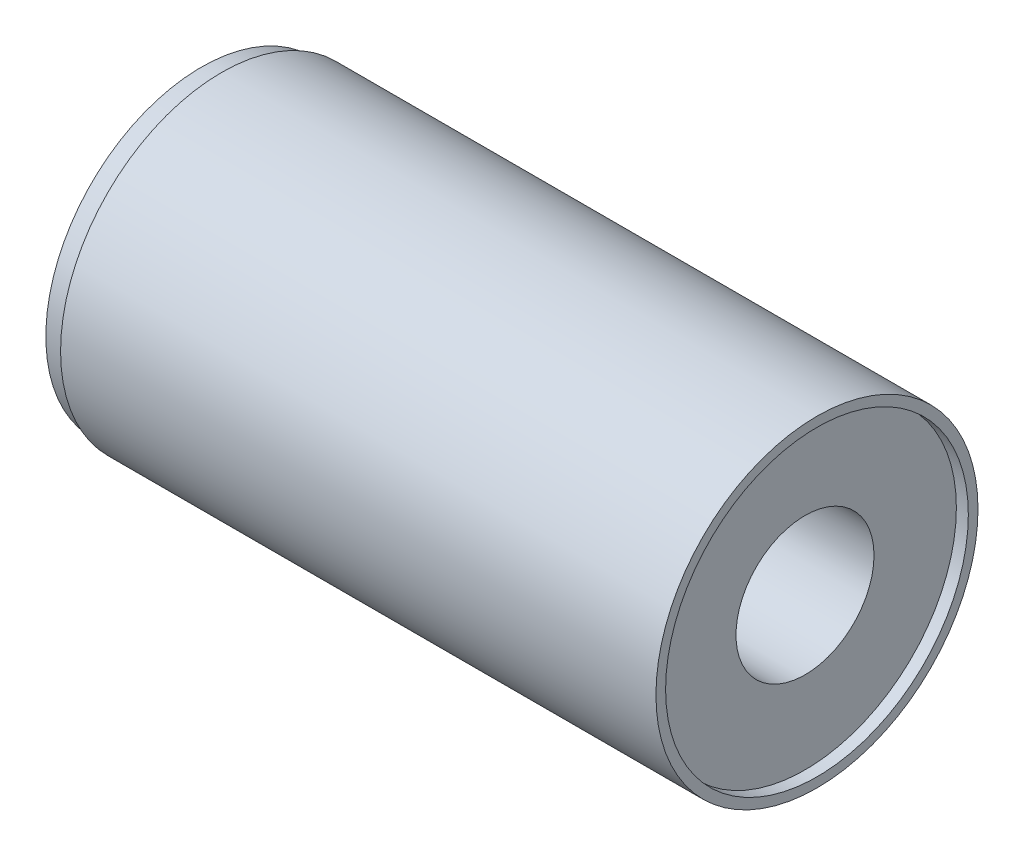
ISO-10303-21;
HEADER;
FILE_DESCRIPTION(('STEP AP214'),'2;1');
FILE_NAME('part.step','',(''),(''),'','','');
FILE_SCHEMA(('AUTOMOTIVE_DESIGN { 1 0 10303 214 1 1 1 1 }'));
ENDSEC;
DATA;
#1=APPLICATION_CONTEXT('core data for automotive mechanical design processes');
#2=APPLICATION_PROTOCOL_DEFINITION('international standard','automotive_design',2000,#1);
#3=PRODUCT_CONTEXT('',#1,'mechanical');
#4=PRODUCT('Part','Part','',(#3));
#5=PRODUCT_RELATED_PRODUCT_CATEGORY('part','',(#4));
#6=PRODUCT_DEFINITION_FORMATION('','',#4);
#7=PRODUCT_DEFINITION_CONTEXT('part definition',#1,'design');
#8=PRODUCT_DEFINITION('design','',#6,#7);
#9=PRODUCT_DEFINITION_SHAPE('','',#8);
#10=(LENGTH_UNIT() NAMED_UNIT(*) SI_UNIT(.MILLI.,.METRE.));
#11=(NAMED_UNIT(*) PLANE_ANGLE_UNIT() SI_UNIT($,.RADIAN.));
#12=(NAMED_UNIT(*) SI_UNIT($,.STERADIAN.) SOLID_ANGLE_UNIT());
#13=UNCERTAINTY_MEASURE_WITH_UNIT(LENGTH_MEASURE(1.E-05),#10,'distance_accuracy_value','');
#14=(GEOMETRIC_REPRESENTATION_CONTEXT(3) GLOBAL_UNCERTAINTY_ASSIGNED_CONTEXT((#13)) GLOBAL_UNIT_ASSIGNED_CONTEXT((#10,
#11,#12)) REPRESENTATION_CONTEXT('',''));
#15=CARTESIAN_POINT('',(0.,0.,0.));
#16=DIRECTION('',(0.,0.,1.));
#17=DIRECTION('',(1.,0.,0.));
#18=AXIS2_PLACEMENT_3D('',#15,#16,#17);
#19=CARTESIAN_POINT('',(53.35,0.,9.75));
#20=DIRECTION('',(1.,0.,0.));
#21=DIRECTION('',(0.,1.,0.));
#22=AXIS2_PLACEMENT_3D('',#19,#20,#21);
#23=PLANE('',#22);
#24=CARTESIAN_POINT('',(53.35,0.,9.75));
#25=DIRECTION('',(-1.,0.,0.));
#26=DIRECTION('',(0.,0.,1.));
#27=AXIS2_PLACEMENT_3D('',#24,#25,#26);
#28=CIRCLE('',#27,0.75);
#29=CARTESIAN_POINT('',(53.35,0.,10.5));
#30=VERTEX_POINT('',#29);
#31=EDGE_CURVE('E28',#30,#30,#28,.T.);
#32=ORIENTED_EDGE('',*,*,#31,.T.);
#33=EDGE_LOOP('',(#32));
#34=FACE_BOUND('',#33,.T.);
#35=ADVANCED_FACE('F17',(#34),#23,.F.);
#36=CARTESIAN_POINT('',(52.6,0.,9.75));
#37=DIRECTION('',(-1.,0.,0.));
#38=DIRECTION('',(0.,0.,-1.));
#39=AXIS2_PLACEMENT_3D('',#36,#37,#38);
#40=CYLINDRICAL_SURFACE('',#39,0.75);
#41=ORIENTED_EDGE('',*,*,#31,.F.);
#42=DIRECTION('',(-1.,0.,0.));
#43=VECTOR('',#42,1.);
#44=CARTESIAN_POINT('',(52.6,0.,10.5));
#45=LINE('',#44,#43);
#46=CARTESIAN_POINT('',(51.85,0.,10.5));
#47=VERTEX_POINT('',#46);
#48=EDGE_CURVE('E11',#30,#47,#45,.T.);
#49=ORIENTED_EDGE('',*,*,#48,.T.);
#50=CARTESIAN_POINT('',(51.85,0.,9.75));
#51=DIRECTION('',(1.,0.,0.));
#52=DIRECTION('',(0.,0.,-1.));
#53=AXIS2_PLACEMENT_3D('',#50,#51,#52);
#54=CIRCLE('',#53,0.75);
#55=EDGE_CURVE('E88',#47,#47,#54,.T.);
#56=ORIENTED_EDGE('',*,*,#55,.F.);
#57=ORIENTED_EDGE('',*,*,#48,.F.);
#58=EDGE_LOOP('',(#41,#49,#56,#57));
#59=FACE_BOUND('',#58,.T.);
#60=ADVANCED_FACE('F174',(#59),#40,.F.);
#61=CARTESIAN_POINT('',(49.85,0.,8.));
#62=DIRECTION('',(-1.,0.,0.));
#63=DIRECTION('',(0.,0.,1.));
#64=AXIS2_PLACEMENT_3D('',#61,#62,#63);
#65=PLANE('',#64);
#66=CARTESIAN_POINT('',(49.85,0.,0.));
#67=DIRECTION('',(1.,0.,0.));
#68=DIRECTION('',(0.,0.,-1.));
#69=AXIS2_PLACEMENT_3D('',#66,#67,#68);
#70=CIRCLE('',#69,7.5);
#71=CARTESIAN_POINT('',(49.85,0.,-7.5));
#72=VERTEX_POINT('',#71);
#73=EDGE_CURVE('E133',#72,#72,#70,.T.);
#74=ORIENTED_EDGE('',*,*,#73,.T.);
#75=EDGE_LOOP('',(#74));
#76=FACE_BOUND('',#75,.T.);
#77=CARTESIAN_POINT('',(49.85,0.,0.));
#78=DIRECTION('',(-1.,0.,0.));
#79=DIRECTION('',(0.,0.,-1.));
#80=AXIS2_PLACEMENT_3D('',#77,#78,#79);
#81=CIRCLE('',#80,8.5);
#82=CARTESIAN_POINT('',(49.85,0.,-8.5));
#83=VERTEX_POINT('',#82);
#84=EDGE_CURVE('E92',#83,#83,#81,.T.);
#85=ORIENTED_EDGE('',*,*,#84,.T.);
#86=EDGE_LOOP('',(#85));
#87=FACE_BOUND('',#86,.T.);
#88=ADVANCED_FACE('F19',(#76,#87),#65,.T.);
#89=CARTESIAN_POINT('',(85.3,0.,0.));
#90=DIRECTION('',(-1.,0.,0.));
#91=DIRECTION('',(0.,0.,1.));
#92=AXIS2_PLACEMENT_3D('',#89,#90,#91);
#93=CYLINDRICAL_SURFACE('',#92,7.5);
#94=CARTESIAN_POINT('',(117.45,0.,0.));
#95=DIRECTION('',(-1.,0.,0.));
#96=DIRECTION('',(0.,0.,1.));
#97=AXIS2_PLACEMENT_3D('',#94,#95,#96);
#98=CIRCLE('',#97,7.5);
#99=CARTESIAN_POINT('',(117.45,0.,-7.5));
#100=VERTEX_POINT('',#99);
#101=EDGE_CURVE('E112',#100,#100,#98,.T.);
#102=ORIENTED_EDGE('',*,*,#101,.F.);
#103=DIRECTION('',(-1.,0.,0.));
#104=VECTOR('',#103,1.);
#105=CARTESIAN_POINT('',(85.3,0.,-7.5));
#106=LINE('',#105,#104);
#107=EDGE_CURVE('E115',#100,#72,#106,.T.);
#108=ORIENTED_EDGE('',*,*,#107,.T.);
#109=ORIENTED_EDGE('',*,*,#73,.F.);
#110=ORIENTED_EDGE('',*,*,#107,.F.);
#111=EDGE_LOOP('',(#102,#108,#109,#110));
#112=FACE_BOUND('',#111,.T.);
#113=ADVANCED_FACE('F189',(#112),#93,.F.);
#114=CARTESIAN_POINT('',(117.45,0.,0.));
#115=DIRECTION('',(-1.,0.,0.));
#116=DIRECTION('',(0.,0.,1.));
#117=AXIS2_PLACEMENT_3D('',#114,#115,#116);
#118=PLANE('',#117);
#119=ORIENTED_EDGE('',*,*,#101,.T.);
#120=EDGE_LOOP('',(#119));
#121=FACE_BOUND('',#120,.T.);
#122=CARTESIAN_POINT('',(117.45,0.,0.));
#123=DIRECTION('',(1.,0.,0.));
#124=DIRECTION('',(0.,0.,-1.));
#125=AXIS2_PLACEMENT_3D('',#122,#123,#124);
#126=CIRCLE('',#125,16.45);
#127=CARTESIAN_POINT('',(117.45,0.,-16.45));
#128=VERTEX_POINT('',#127);
#129=EDGE_CURVE('E106',#128,#128,#126,.T.);
#130=ORIENTED_EDGE('',*,*,#129,.T.);
#131=EDGE_LOOP('',(#130));
#132=FACE_BOUND('',#131,.T.);
#133=ADVANCED_FACE('F186',(#121,#132),#118,.F.);
#134=CARTESIAN_POINT('',(118.1,0.,0.));
#135=DIRECTION('',(1.,0.,0.));
#136=DIRECTION('',(0.,0.,1.));
#137=AXIS2_PLACEMENT_3D('',#134,#135,#136);
#138=CYLINDRICAL_SURFACE('',#137,16.45);
#139=ORIENTED_EDGE('',*,*,#129,.F.);
#140=DIRECTION('',(1.,0.,0.));
#141=VECTOR('',#140,1.);
#142=CARTESIAN_POINT('',(118.1,0.,-16.45));
#143=LINE('',#142,#141);
#144=CARTESIAN_POINT('',(118.75,0.,-16.45));
#145=VERTEX_POINT('',#144);
#146=EDGE_CURVE('E110',#128,#145,#143,.T.);
#147=ORIENTED_EDGE('',*,*,#146,.T.);
#148=CARTESIAN_POINT('',(118.75,0.,0.));
#149=DIRECTION('',(-1.,0.,0.));
#150=DIRECTION('',(0.,0.,1.));
#151=AXIS2_PLACEMENT_3D('',#148,#149,#150);
#152=CIRCLE('',#151,16.45);
#153=EDGE_CURVE('E111',#145,#145,#152,.T.);
#154=ORIENTED_EDGE('',*,*,#153,.F.);
#155=ORIENTED_EDGE('',*,*,#146,.F.);
#156=EDGE_LOOP('',(#139,#147,#154,#155));
#157=FACE_BOUND('',#156,.T.);
#158=ADVANCED_FACE('F188',(#157),#138,.F.);
#159=CARTESIAN_POINT('',(118.75,0.,12.5));
#160=DIRECTION('',(1.,0.,0.));
#161=DIRECTION('',(0.,1.,0.));
#162=AXIS2_PLACEMENT_3D('',#159,#160,#161);
#163=PLANE('',#162);
#164=ORIENTED_EDGE('',*,*,#153,.T.);
#165=EDGE_LOOP('',(#164));
#166=FACE_BOUND('',#165,.T.);
#167=CARTESIAN_POINT('',(118.75,0.,0.));
#168=DIRECTION('',(1.,0.,0.));
#169=DIRECTION('',(0.,0.,-1.));
#170=AXIS2_PLACEMENT_3D('',#167,#168,#169);
#171=CIRCLE('',#170,17.5);
#172=CARTESIAN_POINT('',(118.75,0.,-17.5));
#173=VERTEX_POINT('',#172);
#174=EDGE_CURVE('E137',#173,#173,#171,.T.);
#175=ORIENTED_EDGE('',*,*,#174,.T.);
#176=EDGE_LOOP('',(#175));
#177=FACE_BOUND('',#176,.T.);
#178=ADVANCED_FACE('F170',(#166,#177),#163,.T.);
#179=CARTESIAN_POINT('',(86.4,0.,0.));
#180=DIRECTION('',(-1.,0.,0.));
#181=DIRECTION('',(0.,0.,1.));
#182=AXIS2_PLACEMENT_3D('',#179,#180,#181);
#183=CYLINDRICAL_SURFACE('',#182,17.5);
#184=CARTESIAN_POINT('',(54.05,0.,0.));
#185=DIRECTION('',(-1.,0.,0.));
#186=DIRECTION('',(0.,0.,-1.));
#187=AXIS2_PLACEMENT_3D('',#184,#185,#186);
#188=CIRCLE('',#187,17.5);
#189=CARTESIAN_POINT('',(54.05,0.,-17.5));
#190=VERTEX_POINT('',#189);
#191=EDGE_CURVE('E145',#190,#190,#188,.T.);
#192=ORIENTED_EDGE('',*,*,#191,.F.);
#193=DIRECTION('',(1.,0.,0.));
#194=VECTOR('',#193,1.);
#195=CARTESIAN_POINT('',(86.4,0.,-17.5));
#196=LINE('',#195,#194);
#197=EDGE_CURVE('E142',#190,#173,#196,.T.);
#198=ORIENTED_EDGE('',*,*,#197,.T.);
#199=ORIENTED_EDGE('',*,*,#174,.F.);
#200=ORIENTED_EDGE('',*,*,#197,.F.);
#201=EDGE_LOOP('',(#192,#198,#199,#200));
#202=FACE_BOUND('',#201,.T.);
#203=ADVANCED_FACE('F159',(#202),#183,.T.);
#204=CARTESIAN_POINT('',(54.05,0.,17.2));
#205=DIRECTION('',(-1.,0.,0.));
#206=DIRECTION('',(0.,0.,1.));
#207=AXIS2_PLACEMENT_3D('',#204,#205,#206);
#208=PLANE('',#207);
#209=CARTESIAN_POINT('',(54.05,0.,0.));
#210=DIRECTION('',(1.,0.,0.));
#211=DIRECTION('',(0.,0.,-1.));
#212=AXIS2_PLACEMENT_3D('',#209,#210,#211);
#213=CIRCLE('',#212,16.9);
#214=CARTESIAN_POINT('',(54.05,0.,-16.9));
#215=VERTEX_POINT('',#214);
#216=EDGE_CURVE('E86',#215,#215,#213,.T.);
#217=ORIENTED_EDGE('',*,*,#216,.T.);
#218=EDGE_LOOP('',(#217));
#219=FACE_BOUND('',#218,.T.);
#220=ORIENTED_EDGE('',*,*,#191,.T.);
#221=EDGE_LOOP('',(#220));
#222=FACE_BOUND('',#221,.T.);
#223=ADVANCED_FACE('F161',(#219,#222),#208,.T.);
#224=CARTESIAN_POINT('',(52.95,0.,0.));
#225=DIRECTION('',(-1.,0.,0.));
#226=DIRECTION('',(0.,0.,1.));
#227=AXIS2_PLACEMENT_3D('',#224,#225,#226);
#228=CYLINDRICAL_SURFACE('',#227,16.9);
#229=CARTESIAN_POINT('',(51.85,0.,0.));
#230=DIRECTION('',(-1.,0.,0.));
#231=DIRECTION('',(0.,0.,-1.));
#232=AXIS2_PLACEMENT_3D('',#229,#230,#231);
#233=CIRCLE('',#232,16.9);
#234=CARTESIAN_POINT('',(51.85,0.,-16.9));
#235=VERTEX_POINT('',#234);
#236=EDGE_CURVE('E84',#235,#235,#233,.T.);
#237=ORIENTED_EDGE('',*,*,#236,.F.);
#238=DIRECTION('',(1.,0.,0.));
#239=VECTOR('',#238,1.);
#240=CARTESIAN_POINT('',(52.95,0.,-16.9));
#241=LINE('',#240,#239);
#242=EDGE_CURVE('E21',#235,#215,#241,.T.);
#243=ORIENTED_EDGE('',*,*,#242,.T.);
#244=ORIENTED_EDGE('',*,*,#216,.F.);
#245=ORIENTED_EDGE('',*,*,#242,.F.);
#246=EDGE_LOOP('',(#237,#243,#244,#245));
#247=FACE_BOUND('',#246,.T.);
#248=ADVANCED_FACE('F83',(#247),#228,.T.);
#249=CARTESIAN_POINT('',(51.85,0.,12.2));
#250=DIRECTION('',(-1.,0.,0.));
#251=DIRECTION('',(0.,0.,1.));
#252=AXIS2_PLACEMENT_3D('',#249,#250,#251);
#253=PLANE('',#252);
#254=CARTESIAN_POINT('',(51.85,0.,0.));
#255=DIRECTION('',(1.,0.,0.));
#256=DIRECTION('',(0.,0.,-1.));
#257=AXIS2_PLACEMENT_3D('',#254,#255,#256);
#258=CIRCLE('',#257,8.5);
#259=CARTESIAN_POINT('',(51.85,0.,-8.5));
#260=VERTEX_POINT('',#259);
#261=EDGE_CURVE('E116',#260,#260,#258,.T.);
#262=ORIENTED_EDGE('',*,*,#261,.T.);
#263=EDGE_LOOP('',(#262));
#264=FACE_BOUND('',#263,.T.);
#265=ORIENTED_EDGE('',*,*,#55,.T.);
#266=EDGE_LOOP('',(#265));
#267=FACE_BOUND('',#266,.T.);
#268=ORIENTED_EDGE('',*,*,#236,.T.);
#269=EDGE_LOOP('',(#268));
#270=FACE_BOUND('',#269,.T.);
#271=ADVANCED_FACE('F90',(#264,#267,#270),#253,.T.);
#272=CARTESIAN_POINT('',(50.85,0.,0.));
#273=DIRECTION('',(1.,0.,0.));
#274=DIRECTION('',(0.,0.,1.));
#275=AXIS2_PLACEMENT_3D('',#272,#273,#274);
#276=CYLINDRICAL_SURFACE('',#275,8.5);
#277=ORIENTED_EDGE('',*,*,#261,.F.);
#278=DIRECTION('',(-1.,0.,0.));
#279=VECTOR('',#278,1.);
#280=CARTESIAN_POINT('',(50.85,0.,-8.5));
#281=LINE('',#280,#279);
#282=EDGE_CURVE('E101',#260,#83,#281,.T.);
#283=ORIENTED_EDGE('',*,*,#282,.T.);
#284=ORIENTED_EDGE('',*,*,#84,.F.);
#285=ORIENTED_EDGE('',*,*,#282,.F.);
#286=EDGE_LOOP('',(#277,#283,#284,#285));
#287=FACE_BOUND('',#286,.T.);
#288=ADVANCED_FACE('F183',(#287),#276,.T.);
#289=CLOSED_SHELL('',(#35,#60,#88,#113,#133,#158,#178,#203,#223,#248,#271,#288));
#290=MANIFOLD_SOLID_BREP('B1',#289);
#291=ADVANCED_BREP_SHAPE_REPRESENTATION('',(#18,#290),#14);
#292=SHAPE_DEFINITION_REPRESENTATION(#9,#291);
ENDSEC;
END-ISO-10303-21;
